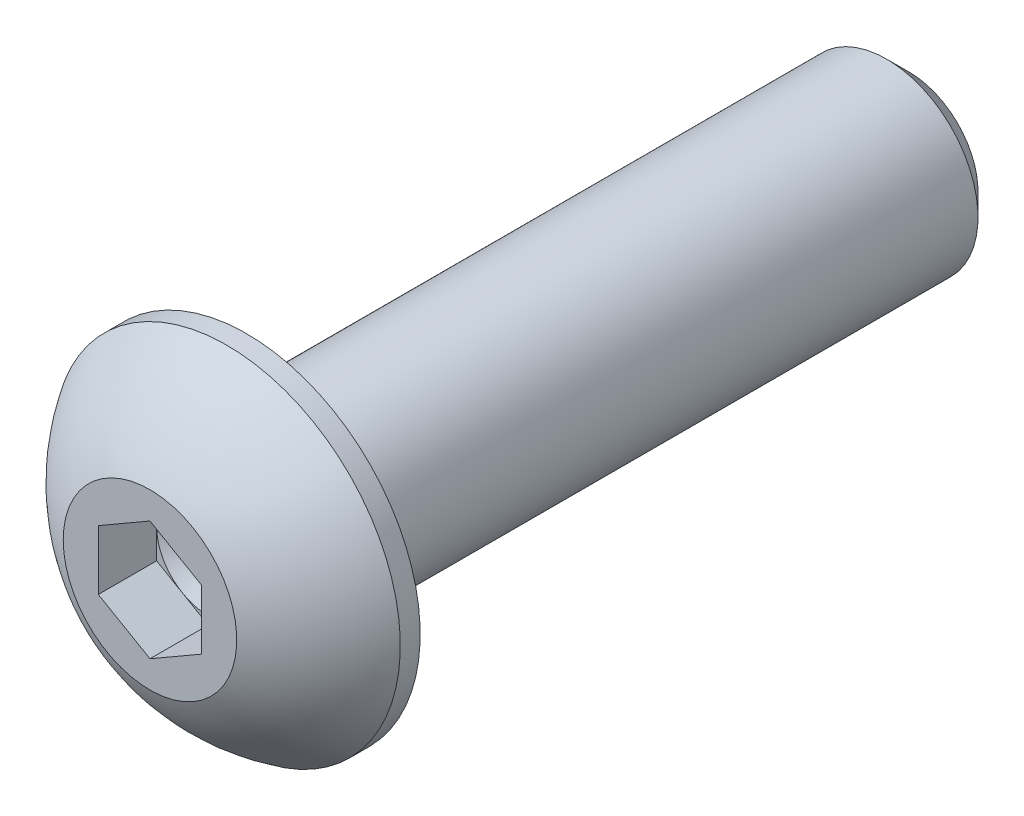
ISO-10303-21;
HEADER;
FILE_DESCRIPTION(('STEP AP214'),'2;1');
FILE_NAME('part.step','',(''),(''),'','','');
FILE_SCHEMA(('AUTOMOTIVE_DESIGN { 1 0 10303 214 1 1 1 1 }'));
ENDSEC;
DATA;
#1=APPLICATION_CONTEXT('core data for automotive mechanical design processes');
#2=APPLICATION_PROTOCOL_DEFINITION('international standard','automotive_design',2000,#1);
#3=PRODUCT_CONTEXT('',#1,'mechanical');
#4=PRODUCT('Part','Part','',(#3));
#5=PRODUCT_RELATED_PRODUCT_CATEGORY('part','',(#4));
#6=PRODUCT_DEFINITION_FORMATION('','',#4);
#7=PRODUCT_DEFINITION_CONTEXT('part definition',#1,'design');
#8=PRODUCT_DEFINITION('design','',#6,#7);
#9=PRODUCT_DEFINITION_SHAPE('','',#8);
#10=(LENGTH_UNIT() NAMED_UNIT(*) SI_UNIT(.MILLI.,.METRE.));
#11=(NAMED_UNIT(*) PLANE_ANGLE_UNIT() SI_UNIT($,.RADIAN.));
#12=(NAMED_UNIT(*) SI_UNIT($,.STERADIAN.) SOLID_ANGLE_UNIT());
#13=UNCERTAINTY_MEASURE_WITH_UNIT(LENGTH_MEASURE(1.E-05),#10,'distance_accuracy_value','');
#14=(GEOMETRIC_REPRESENTATION_CONTEXT(3) GLOBAL_UNCERTAINTY_ASSIGNED_CONTEXT((#13)) GLOBAL_UNIT_ASSIGNED_CONTEXT((#10,
#11,#12)) REPRESENTATION_CONTEXT('',''));
#15=CARTESIAN_POINT('',(0.,0.,0.));
#16=DIRECTION('',(0.,0.,1.));
#17=DIRECTION('',(1.,0.,0.));
#18=AXIS2_PLACEMENT_3D('',#15,#16,#17);
#19=CARTESIAN_POINT('',(0.,0.,-1.1176));
#20=DIRECTION('',(0.,0.,1.));
#21=DIRECTION('',(1.,0.,0.));
#22=AXIS2_PLACEMENT_3D('',#19,#20,#21);
#23=PLANE('',#22);
#24=CARTESIAN_POINT('',(0.,0.,-1.1176));
#25=DIRECTION('',(0.,0.,1.));
#26=DIRECTION('',(1.,0.,0.));
#27=AXIS2_PLACEMENT_3D('',#24,#25,#26);
#28=CIRCLE('',#27,0.9906);
#29=CARTESIAN_POINT('',(0.9906,0.,-1.1176));
#30=VERTEX_POINT('',#29);
#31=CARTESIAN_POINT('',(0.4953,0.857884764988865,-1.1176));
#32=VERTEX_POINT('',#31);
#33=EDGE_CURVE('E96',#30,#32,#28,.T.);
#34=ORIENTED_EDGE('',*,*,#33,.F.);
#35=DIRECTION('',(0.,-1.,0.));
#36=VECTOR('',#35,1.);
#37=CARTESIAN_POINT('',(0.9906,0.,-1.1176));
#38=LINE('',#37,#36);
#39=CARTESIAN_POINT('',(0.9906,0.571923176659244,-1.1176));
#40=VERTEX_POINT('',#39);
#41=EDGE_CURVE('E120',#40,#30,#38,.T.);
#42=ORIENTED_EDGE('',*,*,#41,.F.);
#43=DIRECTION('',(0.866025403784438,-0.5,0.));
#44=VECTOR('',#43,1.);
#45=CARTESIAN_POINT('',(0.4953,0.857884764988865,-1.1176));
#46=LINE('',#45,#44);
#47=EDGE_CURVE('E118',#32,#40,#46,.T.);
#48=ORIENTED_EDGE('',*,*,#47,.F.);
#49=EDGE_LOOP('',(#34,#42,#48));
#50=FACE_BOUND('',#49,.T.);
#51=ADVANCED_FACE('F17',(#50),#23,.T.);
#52=CARTESIAN_POINT('',(-0.4953,0.857884764988864,-1.1176));
#53=VERTEX_POINT('',#52);
#54=EDGE_CURVE('E98',#32,#53,#28,.T.);
#55=ORIENTED_EDGE('',*,*,#54,.F.);
#56=CARTESIAN_POINT('',(0.,1.14384635331849,-1.1176));
#57=VERTEX_POINT('',#56);
#58=EDGE_CURVE('E113',#57,#32,#46,.T.);
#59=ORIENTED_EDGE('',*,*,#58,.F.);
#60=DIRECTION('',(0.866025403784438,0.5,0.));
#61=VECTOR('',#60,1.);
#62=CARTESIAN_POINT('',(-0.4953,0.857884764988864,-1.1176));
#63=LINE('',#62,#61);
#64=EDGE_CURVE('E114',#53,#57,#63,.T.);
#65=ORIENTED_EDGE('',*,*,#64,.F.);
#66=EDGE_LOOP('',(#55,#59,#65));
#67=FACE_BOUND('',#66,.T.);
#68=ADVANCED_FACE('F111',(#67),#23,.T.);
#69=CARTESIAN_POINT('',(-0.9906,0.,-1.1176));
#70=VERTEX_POINT('',#69);
#71=EDGE_CURVE('E117',#53,#70,#28,.T.);
#72=ORIENTED_EDGE('',*,*,#71,.F.);
#73=CARTESIAN_POINT('',(-0.9906,0.571923176659242,-1.1176));
#74=VERTEX_POINT('',#73);
#75=EDGE_CURVE('E134',#74,#53,#63,.T.);
#76=ORIENTED_EDGE('',*,*,#75,.F.);
#77=DIRECTION('',(0.,1.,0.));
#78=VECTOR('',#77,1.);
#79=CARTESIAN_POINT('',(-0.9906,0.,-1.1176));
#80=LINE('',#79,#78);
#81=EDGE_CURVE('E138',#70,#74,#80,.T.);
#82=ORIENTED_EDGE('',*,*,#81,.F.);
#83=EDGE_LOOP('',(#72,#76,#82));
#84=FACE_BOUND('',#83,.T.);
#85=ADVANCED_FACE('F226',(#84),#23,.T.);
#86=CARTESIAN_POINT('',(-0.4953,-0.857884764988865,-1.1176));
#87=VERTEX_POINT('',#86);
#88=EDGE_CURVE('E251',#70,#87,#28,.T.);
#89=ORIENTED_EDGE('',*,*,#88,.F.);
#90=CARTESIAN_POINT('',(-0.9906,-0.571923176659243,-1.1176));
#91=VERTEX_POINT('',#90);
#92=EDGE_CURVE('E139',#91,#70,#80,.T.);
#93=ORIENTED_EDGE('',*,*,#92,.F.);
#94=DIRECTION('',(-0.866025403784439,0.5,0.));
#95=VECTOR('',#94,1.);
#96=CARTESIAN_POINT('',(-0.4953,-0.857884764988865,-1.1176));
#97=LINE('',#96,#95);
#98=EDGE_CURVE('E143',#87,#91,#97,.T.);
#99=ORIENTED_EDGE('',*,*,#98,.F.);
#100=EDGE_LOOP('',(#89,#93,#99));
#101=FACE_BOUND('',#100,.T.);
#102=ADVANCED_FACE('F238',(#101),#23,.T.);
#103=CARTESIAN_POINT('',(0.4953,-0.857884764988864,-1.1176));
#104=VERTEX_POINT('',#103);
#105=EDGE_CURVE('E33',#87,#104,#28,.T.);
#106=ORIENTED_EDGE('',*,*,#105,.F.);
#107=CARTESIAN_POINT('',(0.,-1.14384635331849,-1.1176));
#108=VERTEX_POINT('',#107);
#109=EDGE_CURVE('E144',#108,#87,#97,.T.);
#110=ORIENTED_EDGE('',*,*,#109,.F.);
#111=DIRECTION('',(-0.866025403784438,-0.5,0.));
#112=VECTOR('',#111,1.);
#113=CARTESIAN_POINT('',(0.4953,-0.857884764988864,-1.1176));
#114=LINE('',#113,#112);
#115=EDGE_CURVE('E148',#104,#108,#114,.T.);
#116=ORIENTED_EDGE('',*,*,#115,.F.);
#117=EDGE_LOOP('',(#106,#110,#116));
#118=FACE_BOUND('',#117,.T.);
#119=ADVANCED_FACE('F231',(#118),#23,.T.);
#120=CARTESIAN_POINT('',(-0.83185,0.,0.));
#121=DIRECTION('',(0.,0.,1.));
#122=DIRECTION('',(1.,0.,0.));
#123=AXIS2_PLACEMENT_3D('',#120,#121,#122);
#124=PLANE('',#123);
#125=CARTESIAN_POINT('',(0.,0.,0.));
#126=DIRECTION('',(0.,0.,-1.));
#127=DIRECTION('',(-1.,0.,0.));
#128=AXIS2_PLACEMENT_3D('',#125,#126,#127);
#129=CIRCLE('',#128,1.6637);
#130=CARTESIAN_POINT('',(-1.66369999999999,0.,0.));
#131=VERTEX_POINT('',#130);
#132=EDGE_CURVE('E197',#131,#131,#129,.T.);
#133=ORIENTED_EDGE('',*,*,#132,.F.);
#134=EDGE_LOOP('',(#133));
#135=FACE_BOUND('',#134,.T.);
#136=DIRECTION('',(0.866025403784438,0.5,0.));
#137=VECTOR('',#136,1.);
#138=CARTESIAN_POINT('',(-0.4953,0.857884764988864,0.));
#139=LINE('',#138,#137);
#140=CARTESIAN_POINT('',(-0.9906,0.571923176659242,0.));
#141=VERTEX_POINT('',#140);
#142=CARTESIAN_POINT('',(0.,1.14384635331849,0.));
#143=VERTEX_POINT('',#142);
#144=EDGE_CURVE('E160',#141,#143,#139,.T.);
#145=ORIENTED_EDGE('',*,*,#144,.T.);
#146=DIRECTION('',(0.866025403784438,-0.5,0.));
#147=VECTOR('',#146,1.);
#148=CARTESIAN_POINT('',(0.4953,0.857884764988865,0.));
#149=LINE('',#148,#147);
#150=CARTESIAN_POINT('',(0.9906,0.571923176659244,0.));
#151=VERTEX_POINT('',#150);
#152=EDGE_CURVE('E106',#143,#151,#149,.T.);
#153=ORIENTED_EDGE('',*,*,#152,.T.);
#154=DIRECTION('',(0.,-1.,0.));
#155=VECTOR('',#154,1.);
#156=CARTESIAN_POINT('',(0.9906,0.,0.));
#157=LINE('',#156,#155);
#158=CARTESIAN_POINT('',(0.9906,-0.571923176659244,0.));
#159=VERTEX_POINT('',#158);
#160=EDGE_CURVE('E124',#151,#159,#157,.T.);
#161=ORIENTED_EDGE('',*,*,#160,.T.);
#162=DIRECTION('',(-0.866025403784438,-0.5,0.));
#163=VECTOR('',#162,1.);
#164=CARTESIAN_POINT('',(0.4953,-0.857884764988864,0.));
#165=LINE('',#164,#163);
#166=CARTESIAN_POINT('',(0.,-1.14384635331849,0.));
#167=VERTEX_POINT('',#166);
#168=EDGE_CURVE('E41',#159,#167,#165,.T.);
#169=ORIENTED_EDGE('',*,*,#168,.T.);
#170=DIRECTION('',(-0.866025403784439,0.5,0.));
#171=VECTOR('',#170,1.);
#172=CARTESIAN_POINT('',(-0.4953,-0.857884764988865,0.));
#173=LINE('',#172,#171);
#174=CARTESIAN_POINT('',(-0.9906,-0.571923176659243,0.));
#175=VERTEX_POINT('',#174);
#176=EDGE_CURVE('E168',#167,#175,#173,.T.);
#177=ORIENTED_EDGE('',*,*,#176,.T.);
#178=DIRECTION('',(0.,1.,0.));
#179=VECTOR('',#178,1.);
#180=CARTESIAN_POINT('',(-0.9906,0.,0.));
#181=LINE('',#180,#179);
#182=EDGE_CURVE('E164',#175,#141,#181,.T.);
#183=ORIENTED_EDGE('',*,*,#182,.T.);
#184=EDGE_LOOP('',(#145,#153,#161,#169,#177,#183));
#185=FACE_BOUND('',#184,.T.);
#186=ADVANCED_FACE('F237',(#135,#185),#124,.T.);
#187=CARTESIAN_POINT('',(0.,0.,1.48381805047393));
#188=DIRECTION('',(0.,0.,-1.));
#189=DIRECTION('',(-1.,0.,0.));
#190=AXIS2_PLACEMENT_3D('',#187,#188,#189);
#191=CYLINDRICAL_SURFACE('',#190,3.3274);
#192=CARTESIAN_POINT('',(0.,0.,-1.4732));
#193=DIRECTION('',(0.,0.,-1.));
#194=DIRECTION('',(-1.,0.,0.));
#195=AXIS2_PLACEMENT_3D('',#192,#193,#194);
#196=CIRCLE('',#195,3.3274);
#197=CARTESIAN_POINT('',(-3.3274,0.,-1.4732));
#198=VERTEX_POINT('',#197);
#199=EDGE_CURVE('E193',#198,#198,#196,.T.);
#200=ORIENTED_EDGE('',*,*,#199,.T.);
#201=EDGE_LOOP('',(#200));
#202=FACE_BOUND('',#201,.T.);
#203=CARTESIAN_POINT('',(0.,0.,-1.8542));
#204=DIRECTION('',(0.,0.,-1.));
#205=DIRECTION('',(-1.,0.,0.));
#206=AXIS2_PLACEMENT_3D('',#203,#204,#205);
#207=CIRCLE('',#206,3.3274);
#208=CARTESIAN_POINT('',(-3.3274,0.,-1.8542));
#209=VERTEX_POINT('',#208);
#210=EDGE_CURVE('E208',#209,#209,#207,.T.);
#211=ORIENTED_EDGE('',*,*,#210,.F.);
#212=EDGE_LOOP('',(#211));
#213=FACE_BOUND('',#212,.T.);
#214=ADVANCED_FACE('F243',(#202,#213),#191,.T.);
#215=CARTESIAN_POINT('',(-2.667,0.,-1.8542));
#216=DIRECTION('',(0.,0.,-1.));
#217=DIRECTION('',(-1.,0.,0.));
#218=AXIS2_PLACEMENT_3D('',#215,#216,#217);
#219=PLANE('',#218);
#220=ORIENTED_EDGE('',*,*,#210,.T.);
#221=EDGE_LOOP('',(#220));
#222=FACE_BOUND('',#221,.T.);
#223=CARTESIAN_POINT('',(0.,0.,-1.8542));
#224=DIRECTION('',(0.,0.,-1.));
#225=DIRECTION('',(-1.,0.,0.));
#226=AXIS2_PLACEMENT_3D('',#223,#224,#225);
#227=CIRCLE('',#226,2.0066);
#228=CARTESIAN_POINT('',(-2.0066,0.,-1.8542));
#229=VERTEX_POINT('',#228);
#230=EDGE_CURVE('E204',#229,#229,#227,.T.);
#231=ORIENTED_EDGE('',*,*,#230,.F.);
#232=EDGE_LOOP('',(#231));
#233=FACE_BOUND('',#232,.T.);
#234=ADVANCED_FACE('F311',(#222,#233),#219,.T.);
#235=CARTESIAN_POINT('',(0.,0.,-2.1082));
#236=DIRECTION('',(0.,0.,-1.));
#237=DIRECTION('',(-1.,0.,0.));
#238=AXIS2_PLACEMENT_3D('',#235,#236,#237);
#239=TOROIDAL_SURFACE('',#238,2.0066,0.254);
#240=ORIENTED_EDGE('',*,*,#230,.T.);
#241=EDGE_LOOP('',(#240));
#242=FACE_BOUND('',#241,.T.);
#243=CARTESIAN_POINT('',(0.,0.,-2.1082));
#244=DIRECTION('',(0.,0.,-1.));
#245=DIRECTION('',(-1.,0.,0.));
#246=AXIS2_PLACEMENT_3D('',#243,#244,#245);
#247=CIRCLE('',#246,1.7526);
#248=CARTESIAN_POINT('',(-1.7526,0.,-2.1082));
#249=VERTEX_POINT('',#248);
#250=EDGE_CURVE('E201',#249,#249,#247,.T.);
#251=ORIENTED_EDGE('',*,*,#250,.F.);
#252=EDGE_LOOP('',(#251));
#253=FACE_BOUND('',#252,.T.);
#254=ADVANCED_FACE('F319',(#242,#253),#239,.F.);
#255=CARTESIAN_POINT('',(0.,0.,1.48381805047393));
#256=DIRECTION('',(0.,0.,-1.));
#257=DIRECTION('',(-1.,0.,0.));
#258=AXIS2_PLACEMENT_3D('',#255,#256,#257);
#259=CYLINDRICAL_SURFACE('',#258,1.7526);
#260=CARTESIAN_POINT('',(0.,0.,-14.12525761938));
#261=DIRECTION('',(0.,0.,-1.));
#262=DIRECTION('',(-1.,0.,0.));
#263=AXIS2_PLACEMENT_3D('',#260,#261,#262);
#264=CIRCLE('',#263,1.7526);
#265=CARTESIAN_POINT('',(-1.7526,0.,-14.12525761938));
#266=VERTEX_POINT('',#265);
#267=EDGE_CURVE('E11',#266,#266,#264,.F.);
#268=ORIENTED_EDGE('',*,*,#267,.T.);
#269=EDGE_LOOP('',(#268));
#270=FACE_BOUND('',#269,.T.);
#271=ORIENTED_EDGE('',*,*,#250,.T.);
#272=EDGE_LOOP('',(#271));
#273=FACE_BOUND('',#272,.T.);
#274=ADVANCED_FACE('F328',(#270,#273),#259,.T.);
#275=CARTESIAN_POINT('',(-0.8763,0.,-14.5542));
#276=DIRECTION('',(0.,0.,-1.));
#277=DIRECTION('',(-1.,0.,0.));
#278=AXIS2_PLACEMENT_3D('',#275,#276,#277);
#279=PLANE('',#278);
#280=CARTESIAN_POINT('',(0.,0.,-14.5542));
#281=DIRECTION('',(0.,0.,-1.));
#282=DIRECTION('',(-1.,0.,0.));
#283=AXIS2_PLACEMENT_3D('',#280,#281,#282);
#284=CIRCLE('',#283,1.32365761938);
#285=CARTESIAN_POINT('',(-1.32365761938,0.,-14.5542));
#286=VERTEX_POINT('',#285);
#287=EDGE_CURVE('E26',#286,#286,#284,.T.);
#288=ORIENTED_EDGE('',*,*,#287,.T.);
#289=EDGE_LOOP('',(#288));
#290=FACE_BOUND('',#289,.T.);
#291=ADVANCED_FACE('F215',(#290),#279,.T.);
#292=CARTESIAN_POINT('',(0.,0.,-3.55485043103449));
#293=DIRECTION('',(0.,0.,-1.));
#294=DIRECTION('',(-1.,0.,0.));
#295=AXIS2_PLACEMENT_3D('',#292,#293,#294);
#296=SPHERICAL_SURFACE('',#295,3.92490245445999);
#297=CARTESIAN_POINT('',(-3.3274,0.,-1.4732));
#298=CARTESIAN_POINT('',(-3.31495281350127,0.,-1.45330383338302));
#299=CARTESIAN_POINT('',(-3.30232713364523,0.,-1.43351933465701));
#300=CARTESIAN_POINT('',(-3.27672293945236,0.,-1.39417998096444));
#301=CARTESIAN_POINT('',(-3.26374442511553,0.,-1.37462512599787));
#302=CARTESIAN_POINT('',(-3.23743871419496,0.,-1.33575136780167));
#303=CARTESIAN_POINT('',(-3.22411151761122,0.,-1.31643246457203));
#304=CARTESIAN_POINT('',(-3.19711273705128,0.,-1.27803682210257));
#305=CARTESIAN_POINT('',(-3.18344115307508,0.,-1.25896008286274));
#306=CARTESIAN_POINT('',(-3.15575799525025,0.,-1.22105490800766));
#307=CARTESIAN_POINT('',(-3.14174642140161,0.,-1.20222647239241));
#308=CARTESIAN_POINT('',(-3.11338779293801,0.,-1.1648239631005));
#309=CARTESIAN_POINT('',(-3.09904073832305,0.,-1.14624988942385));
#310=CARTESIAN_POINT('',(-3.07001576479871,0.,-1.1093620808555));
#311=CARTESIAN_POINT('',(-3.05533784588932,0.,-1.09104834596381));
#312=CARTESIAN_POINT('',(-3.02565586687034,0.,-1.05468710793785));
#313=CARTESIAN_POINT('',(-3.01065180676075,0.,-1.03663960480358));
#314=CARTESIAN_POINT('',(-2.98032237333929,0.,-1.00081663762422));
#315=CARTESIAN_POINT('',(-2.96499700002742,0.,-0.983041173579127));
#316=CARTESIAN_POINT('',(-2.93402987160278,0.,-0.947768004365812));
#317=CARTESIAN_POINT('',(-2.91838811648999,0.,-0.930270299197586));
#318=CARTESIAN_POINT('',(-2.88679325766719,0.,-0.895558278150385));
#319=CARTESIAN_POINT('',(-2.87084015395718,0.,-0.878343962271411));
#320=CARTESIAN_POINT('',(-2.83862773133017,0.,-0.844204259025565));
#321=CARTESIAN_POINT('',(-2.82236841241317,0.,-0.827278871658693));
#322=CARTESIAN_POINT('',(-2.78954879129617,0.,-0.793722471688619));
#323=CARTESIAN_POINT('',(-2.77298848909616,0.,-0.777091459085417));
#324=CARTESIAN_POINT('',(-2.73957223018758,0.,-0.744129160170296));
#325=CARTESIAN_POINT('',(-2.722716273479,0.,-0.727797873858376));
#326=CARTESIAN_POINT('',(-2.68871412946341,0.,-0.695440282607509));
#327=CARTESIAN_POINT('',(-2.6715679421564,0.,-0.679413977668562));
#328=CARTESIAN_POINT('',(-2.63699085424448,0.,-0.647671506108411));
#329=CARTESIAN_POINT('',(-2.61955995363958,0.,-0.631955339487209));
#330=CARTESIAN_POINT('',(-2.58441904804749,0.,-0.600838201711007));
#331=CARTESIAN_POINT('',(-2.5667090430603,0.,-0.585437230556009));
#332=CARTESIAN_POINT('',(-2.53101562742945,0.,-0.554955439437069));
#333=CARTESIAN_POINT('',(-2.51303221678579,0.,-0.539874619473129));
#334=CARTESIAN_POINT('',(-2.47679777654429,0.,-0.510037983442904));
#335=CARTESIAN_POINT('',(-2.45854674694644,0.,-0.495282167376619));
#336=CARTESIAN_POINT('',(-2.42178294161331,0.,-0.466100287268537));
#337=CARTESIAN_POINT('',(-2.40327016587801,0.,-0.45167422322674));
#338=CARTESIAN_POINT('',(-2.36598882531137,0.,-0.423156489186867));
#339=CARTESIAN_POINT('',(-2.34722026048002,0.,-0.409064819188791));
#340=CARTESIAN_POINT('',(-2.30943338107051,0.,-0.38122040765421));
#341=CARTESIAN_POINT('',(-2.29041506649235,0.,-0.367467666117705));
#342=CARTESIAN_POINT('',(-2.25213480730285,0.,-0.340305536863937));
#343=CARTESIAN_POINT('',(-2.23287286269151,0.,-0.326896149146674));
#344=CARTESIAN_POINT('',(-2.19411154154494,0.,-0.300425042403799));
#345=CARTESIAN_POINT('',(-2.17461216500972,0.,-0.287363323378186));
#346=CARTESIAN_POINT('',(-2.13538225452399,0.,-0.26159175702141));
#347=CARTESIAN_POINT('',(-2.11565172057348,0.,-0.248881909690247));
#348=CARTESIAN_POINT('',(-2.0759658441535,0.,-0.223818176487823));
#349=CARTESIAN_POINT('',(-2.05601050168404,0.,-0.211464290616562));
#350=CARTESIAN_POINT('',(-2.01588142943931,0.,-0.187116455603133));
#351=CARTESIAN_POINT('',(-1.99570769966405,0.,-0.175122506460964));
#352=CARTESIAN_POINT('',(-1.9551483443759,0.,-0.151498404186438));
#353=CARTESIAN_POINT('',(-1.93476271886301,0.,-0.139868251054082));
#354=CARTESIAN_POINT('',(-1.89378613154431,0.,-0.116975483644659));
#355=CARTESIAN_POINT('',(-1.8731951697385,0.,-0.105712869367592));
#356=CARTESIAN_POINT('',(-1.83181453649858,0.,-0.0835588019074126));
#357=CARTESIAN_POINT('',(-1.81102486506448,0.,-0.0726673487242994));
#358=CARTESIAN_POINT('',(-1.7692534988934,0.,-0.0512591149920261));
#359=CARTESIAN_POINT('',(-1.74827180415644,0.,-0.040742334442866));
#360=CARTESIAN_POINT('',(-1.7061231554675,0.,-0.0200868043622336));
#361=CARTESIAN_POINT('',(-1.68495620151553,0.,-0.00994805483076118));
#362=CARTESIAN_POINT('',(-1.66369999999999,0.,0.));
#363=B_SPLINE_CURVE_WITH_KNOTS('',3,(#297,#298,#299,#300,#301,#302,#303,#304,#305,#306,#307,
#308,#309,#310,#311,#312,#313,#314,#315,#316,#317,#318,#319,#320,#321,#322,#323,#324,#325,#326,
#327,#328,#329,#330,#331,#332,#333,#334,#335,#336,#337,#338,#339,#340,#341,#342,#343,#344,#345,
#346,#347,#348,#349,#350,#351,#352,#353,#354,#355,#356,#357,#358,#359,#360,#361,#362),
.UNSPECIFIED.,.F.,.F.,(4,2,2,2,2,2,2,2,2,2,2,2,2,2,2,2,2,2,2,2,2,2,2,2,2,2,2,2,2,2,2,2,4),(0.,
0.0704057950343183,0.140811590068636,0.211217385102954,0.281623180137272,0.35202897517159,
0.422434770205908,0.492840565240226,0.563246360274544,0.633652155308862,0.70405795034318,
0.774463745377498,0.844869540411816,0.915275335446133,0.985681130480452,1.05608692551477,
1.12649272054909,1.19689851558341,1.26730431061772,1.33771010565204,1.40811590068636,
1.47852169572068,1.548927490755,1.61933328578931,1.68973908082363,1.76014487585795,
1.83055067089227,1.90095646592659,1.9713622609609,2.04176805599522,2.11217385102954,
2.18257964606386,2.25298544109817),.UNSPECIFIED.);
#364=EDGE_CURVE('BSEAM345',#198,#131,#363,.T.);
#365=ORIENTED_EDGE('',*,*,#199,.F.);
#366=ORIENTED_EDGE('',*,*,#132,.T.);
#367=ORIENTED_EDGE('',*,*,#364,.T.);
#368=ORIENTED_EDGE('',*,*,#364,.F.);
#369=EDGE_LOOP('',(#365,#367,#366,#368));
#370=FACE_BOUND('',#369,.T.);
#371=ADVANCED_FACE('F345',(#370),#296,.T.);
#372=CARTESIAN_POINT('',(0.4953,0.857884764988865,-1.1176));
#373=DIRECTION('',(-0.5,-0.866025403784438,0.));
#374=DIRECTION('',(0.866025403784438,-0.5,0.));
#375=AXIS2_PLACEMENT_3D('',#372,#373,#374);
#376=PLANE('',#375);
#377=ORIENTED_EDGE('',*,*,#152,.F.);
#378=DIRECTION('',(0.,0.,1.));
#379=VECTOR('',#378,1.);
#380=CARTESIAN_POINT('',(0.,1.14384635331849,-1.1176));
#381=LINE('',#380,#379);
#382=EDGE_CURVE('E129',#57,#143,#381,.T.);
#383=ORIENTED_EDGE('',*,*,#382,.F.);
#384=ORIENTED_EDGE('',*,*,#58,.T.);
#385=ORIENTED_EDGE('',*,*,#47,.T.);
#386=DIRECTION('',(0.,0.,1.));
#387=VECTOR('',#386,1.);
#388=CARTESIAN_POINT('',(0.9906,0.571923176659244,-1.1176));
#389=LINE('',#388,#387);
#390=EDGE_CURVE('E156',#40,#151,#389,.T.);
#391=ORIENTED_EDGE('',*,*,#390,.T.);
#392=EDGE_LOOP('',(#377,#383,#384,#385,#391));
#393=FACE_BOUND('',#392,.T.);
#394=ADVANCED_FACE('F128',(#393),#376,.T.);
#395=CARTESIAN_POINT('',(-0.4953,0.857884764988864,-1.1176));
#396=DIRECTION('',(0.5,-0.866025403784437,0.));
#397=DIRECTION('',(0.866025403784438,0.5,0.));
#398=AXIS2_PLACEMENT_3D('',#395,#396,#397);
#399=PLANE('',#398);
#400=ORIENTED_EDGE('',*,*,#144,.F.);
#401=DIRECTION('',(0.,0.,1.));
#402=VECTOR('',#401,1.);
#403=CARTESIAN_POINT('',(-0.9906,0.571923176659242,-1.1176));
#404=LINE('',#403,#402);
#405=EDGE_CURVE('E188',#74,#141,#404,.T.);
#406=ORIENTED_EDGE('',*,*,#405,.F.);
#407=ORIENTED_EDGE('',*,*,#75,.T.);
#408=ORIENTED_EDGE('',*,*,#64,.T.);
#409=ORIENTED_EDGE('',*,*,#382,.T.);
#410=EDGE_LOOP('',(#400,#406,#407,#408,#409));
#411=FACE_BOUND('',#410,.T.);
#412=ADVANCED_FACE('F275',(#411),#399,.T.);
#413=CARTESIAN_POINT('',(-0.9906,0.,-1.1176));
#414=DIRECTION('',(1.,0.,0.));
#415=DIRECTION('',(0.,0.,-1.));
#416=AXIS2_PLACEMENT_3D('',#413,#414,#415);
#417=PLANE('',#416);
#418=ORIENTED_EDGE('',*,*,#182,.F.);
#419=DIRECTION('',(0.,0.,1.));
#420=VECTOR('',#419,1.);
#421=CARTESIAN_POINT('',(-0.9906,-0.571923176659243,-1.1176));
#422=LINE('',#421,#420);
#423=EDGE_CURVE('E185',#91,#175,#422,.T.);
#424=ORIENTED_EDGE('',*,*,#423,.F.);
#425=ORIENTED_EDGE('',*,*,#92,.T.);
#426=ORIENTED_EDGE('',*,*,#81,.T.);
#427=ORIENTED_EDGE('',*,*,#405,.T.);
#428=EDGE_LOOP('',(#418,#424,#425,#426,#427));
#429=FACE_BOUND('',#428,.T.);
#430=ADVANCED_FACE('F270',(#429),#417,.T.);
#431=CARTESIAN_POINT('',(-0.4953,-0.857884764988865,-1.1176));
#432=DIRECTION('',(0.5,0.866025403784438,0.));
#433=DIRECTION('',(-0.866025403784439,0.5,0.));
#434=AXIS2_PLACEMENT_3D('',#431,#432,#433);
#435=PLANE('',#434);
#436=ORIENTED_EDGE('',*,*,#176,.F.);
#437=DIRECTION('',(0.,0.,1.));
#438=VECTOR('',#437,1.);
#439=CARTESIAN_POINT('',(0.,-1.14384635331849,-1.1176));
#440=LINE('',#439,#438);
#441=EDGE_CURVE('E182',#108,#167,#440,.T.);
#442=ORIENTED_EDGE('',*,*,#441,.F.);
#443=ORIENTED_EDGE('',*,*,#109,.T.);
#444=ORIENTED_EDGE('',*,*,#98,.T.);
#445=ORIENTED_EDGE('',*,*,#423,.T.);
#446=EDGE_LOOP('',(#436,#442,#443,#444,#445));
#447=FACE_BOUND('',#446,.T.);
#448=ADVANCED_FACE('F260',(#447),#435,.T.);
#449=CARTESIAN_POINT('',(0.4953,-0.857884764988864,-1.1176));
#450=DIRECTION('',(-0.5,0.866025403784438,0.));
#451=DIRECTION('',(-0.866025403784438,-0.5,0.));
#452=AXIS2_PLACEMENT_3D('',#449,#450,#451);
#453=PLANE('',#452);
#454=ORIENTED_EDGE('',*,*,#168,.F.);
#455=DIRECTION('',(0.,0.,1.));
#456=VECTOR('',#455,1.);
#457=CARTESIAN_POINT('',(0.9906,-0.571923176659244,-1.1176));
#458=LINE('',#457,#456);
#459=CARTESIAN_POINT('',(0.9906,-0.571923176659244,-1.1176));
#460=VERTEX_POINT('',#459);
#461=EDGE_CURVE('E179',#460,#159,#458,.T.);
#462=ORIENTED_EDGE('',*,*,#461,.F.);
#463=EDGE_CURVE('E149',#460,#104,#114,.T.);
#464=ORIENTED_EDGE('',*,*,#463,.T.);
#465=ORIENTED_EDGE('',*,*,#115,.T.);
#466=ORIENTED_EDGE('',*,*,#441,.T.);
#467=EDGE_LOOP('',(#454,#462,#464,#465,#466));
#468=FACE_BOUND('',#467,.T.);
#469=ADVANCED_FACE('F234',(#468),#453,.T.);
#470=CARTESIAN_POINT('',(0.9906,0.,-1.1176));
#471=DIRECTION('',(-1.,0.,0.));
#472=DIRECTION('',(0.,0.,1.));
#473=AXIS2_PLACEMENT_3D('',#470,#471,#472);
#474=PLANE('',#473);
#475=ORIENTED_EDGE('',*,*,#160,.F.);
#476=ORIENTED_EDGE('',*,*,#390,.F.);
#477=ORIENTED_EDGE('',*,*,#41,.T.);
#478=EDGE_CURVE('E153',#30,#460,#38,.T.);
#479=ORIENTED_EDGE('',*,*,#478,.T.);
#480=ORIENTED_EDGE('',*,*,#461,.T.);
#481=EDGE_LOOP('',(#475,#476,#477,#479,#480));
#482=FACE_BOUND('',#481,.T.);
#483=ADVANCED_FACE('F229',(#482),#474,.T.);
#484=EDGE_CURVE('E100',#104,#30,#28,.T.);
#485=ORIENTED_EDGE('',*,*,#484,.F.);
#486=ORIENTED_EDGE('',*,*,#463,.F.);
#487=ORIENTED_EDGE('',*,*,#478,.F.);
#488=EDGE_LOOP('',(#485,#486,#487));
#489=FACE_BOUND('',#488,.T.);
#490=ADVANCED_FACE('F93',(#489),#23,.T.);
#491=CARTESIAN_POINT('',(0.,0.,-1.1176));
#492=DIRECTION('',(0.,0.,1.));
#493=DIRECTION('',(1.,0.,0.));
#494=AXIS2_PLACEMENT_3D('',#491,#492,#493);
#495=CONICAL_SURFACE('',#494,0.9906,1.0471975511966);
#496=CARTESIAN_POINT('',(0.,0.,-1.68952317665925));
#497=VERTEX_POINT('',#496);
#498=VERTEX_LOOP('',#497);
#499=FACE_BOUND('',#498,.T.);
#500=ORIENTED_EDGE('',*,*,#33,.T.);
#501=ORIENTED_EDGE('',*,*,#54,.T.);
#502=ORIENTED_EDGE('',*,*,#71,.T.);
#503=ORIENTED_EDGE('',*,*,#88,.T.);
#504=ORIENTED_EDGE('',*,*,#105,.T.);
#505=ORIENTED_EDGE('',*,*,#484,.T.);
#506=EDGE_LOOP('',(#500,#501,#502,#503,#504,#505));
#507=FACE_BOUND('',#506,.T.);
#508=ADVANCED_FACE('F91',(#499,#507),#495,.F.);
#509=CARTESIAN_POINT('',(0.,0.,-14.5542));
#510=DIRECTION('',(0.,0.,1.));
#511=DIRECTION('',(1.,0.,0.));
#512=AXIS2_PLACEMENT_3D('',#509,#510,#511);
#513=CONICAL_SURFACE('',#512,1.32365761938,0.785398163397446);
#514=ORIENTED_EDGE('',*,*,#267,.F.);
#515=EDGE_LOOP('',(#514));
#516=FACE_BOUND('',#515,.T.);
#517=ORIENTED_EDGE('',*,*,#287,.F.);
#518=EDGE_LOOP('',(#517));
#519=FACE_BOUND('',#518,.T.);
#520=ADVANCED_FACE('F19',(#516,#519),#513,.T.);
#521=CLOSED_SHELL('',(#51,#68,#85,#102,#119,#186,#214,#234,#254,#274,#291,#371,#394,#412,#430,
#448,#469,#483,#490,#508,#520));
#522=MANIFOLD_SOLID_BREP('B1',#521);
#523=ADVANCED_BREP_SHAPE_REPRESENTATION('',(#18,#522),#14);
#524=SHAPE_DEFINITION_REPRESENTATION(#9,#523);
ENDSEC;
END-ISO-10303-21;
